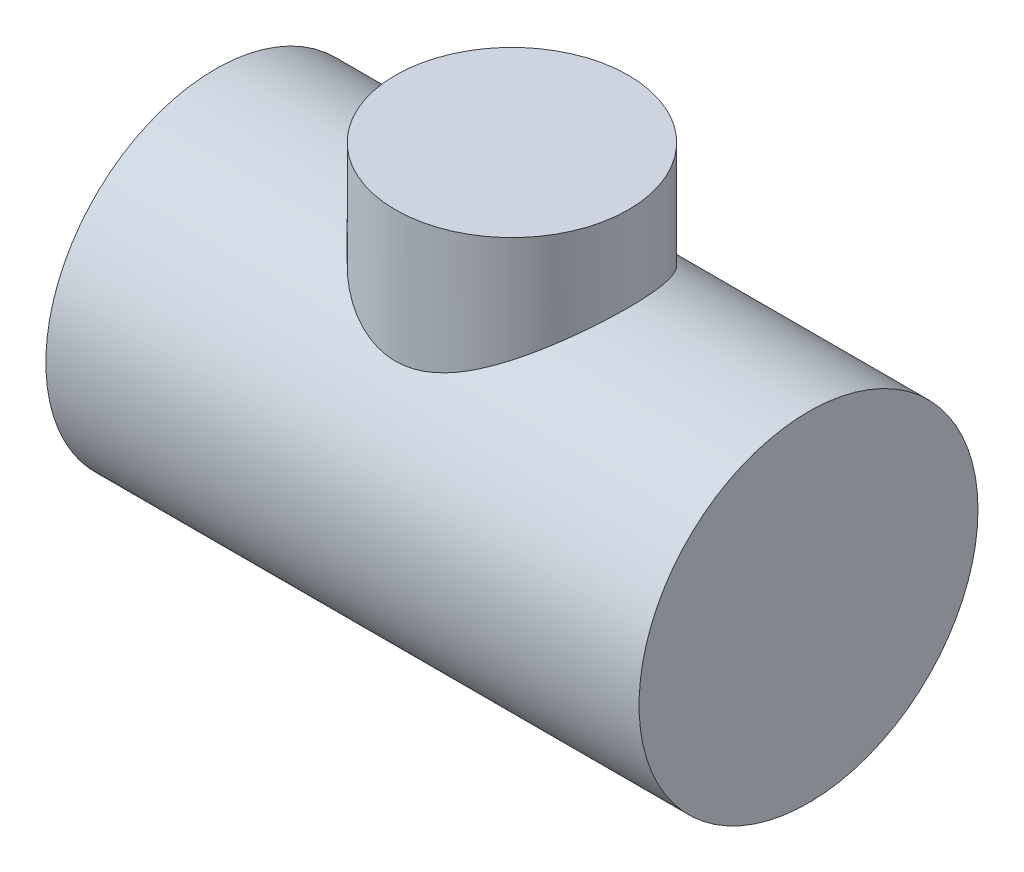
ISO-10303-21;
HEADER;
FILE_DESCRIPTION(('STEP AP214'),'2;1');
FILE_NAME('part.step','',(''),(''),'','','');
FILE_SCHEMA(('AUTOMOTIVE_DESIGN { 1 0 10303 214 1 1 1 1 }'));
ENDSEC;
DATA;
#1=APPLICATION_CONTEXT('core data for automotive mechanical design processes');
#2=APPLICATION_PROTOCOL_DEFINITION('international standard','automotive_design',2000,#1);
#3=PRODUCT_CONTEXT('',#1,'mechanical');
#4=PRODUCT('Part','Part','',(#3));
#5=PRODUCT_RELATED_PRODUCT_CATEGORY('part','',(#4));
#6=PRODUCT_DEFINITION_FORMATION('','',#4);
#7=PRODUCT_DEFINITION_CONTEXT('part definition',#1,'design');
#8=PRODUCT_DEFINITION('design','',#6,#7);
#9=PRODUCT_DEFINITION_SHAPE('','',#8);
#10=(LENGTH_UNIT() NAMED_UNIT(*) SI_UNIT(.MILLI.,.METRE.));
#11=(NAMED_UNIT(*) PLANE_ANGLE_UNIT() SI_UNIT($,.RADIAN.));
#12=(NAMED_UNIT(*) SI_UNIT($,.STERADIAN.) SOLID_ANGLE_UNIT());
#13=UNCERTAINTY_MEASURE_WITH_UNIT(LENGTH_MEASURE(1.E-05),#10,'distance_accuracy_value','');
#14=(GEOMETRIC_REPRESENTATION_CONTEXT(3) GLOBAL_UNCERTAINTY_ASSIGNED_CONTEXT((#13)) GLOBAL_UNIT_ASSIGNED_CONTEXT((#10,
#11,#12)) REPRESENTATION_CONTEXT('',''));
#15=CARTESIAN_POINT('',(0.,0.,0.));
#16=DIRECTION('',(0.,0.,1.));
#17=DIRECTION('',(1.,0.,0.));
#18=AXIS2_PLACEMENT_3D('',#15,#16,#17);
#19=CARTESIAN_POINT('',(88.9,0.,0.));
#20=DIRECTION('',(-1.,0.,0.));
#21=DIRECTION('',(0.,0.,1.));
#22=AXIS2_PLACEMENT_3D('',#19,#20,#21);
#23=CYLINDRICAL_SURFACE('',#22,50.8);
#24=CARTESIAN_POINT('',(88.9,0.,0.));
#25=DIRECTION('',(1.,0.,0.));
#26=DIRECTION('',(0.,0.,-1.));
#27=AXIS2_PLACEMENT_3D('',#24,#25,#26);
#28=CIRCLE('',#27,50.8);
#29=CARTESIAN_POINT('',(88.9,0.,-50.8));
#30=VERTEX_POINT('',#29);
#31=EDGE_CURVE('E42',#30,#30,#28,.T.);
#32=ORIENTED_EDGE('',*,*,#31,.F.);
#33=EDGE_LOOP('',(#32));
#34=FACE_BOUND('',#33,.T.);
#35=CARTESIAN_POINT('',(-88.9,0.,0.));
#36=DIRECTION('',(1.,0.,0.));
#37=DIRECTION('',(0.,0.,-1.));
#38=AXIS2_PLACEMENT_3D('',#35,#36,#37);
#39=CIRCLE('',#38,50.8);
#40=CARTESIAN_POINT('',(-88.9,0.,-50.8));
#41=VERTEX_POINT('',#40);
#42=EDGE_CURVE('E46',#41,#41,#39,.T.);
#43=ORIENTED_EDGE('',*,*,#42,.T.);
#44=EDGE_LOOP('',(#43));
#45=FACE_BOUND('',#44,.T.);
#46=CARTESIAN_POINT('',(0.,36.8901663726257,-34.925));
#47=CARTESIAN_POINT('',(-0.843645731352331,36.8901814735616,-34.9249914845288));
#48=CARTESIAN_POINT('',(-1.68741694630255,36.9192472565266,-34.8943613775967));
#49=CARTESIAN_POINT('',(-3.36673884233864,37.0339946630768,-34.7725461859095));
#50=CARTESIAN_POINT('',(-4.20228770120932,37.1196885618797,-34.6813479718474));
#51=CARTESIAN_POINT('',(-5.85919430438415,37.3435299889975,-34.4402049805243));
#52=CARTESIAN_POINT('',(-6.68052354412421,37.4817724238395,-34.2901538949403));
#53=CARTESIAN_POINT('',(-8.30159253245522,37.8043571230568,-33.9341723961664));
#54=CARTESIAN_POINT('',(-9.10133197777859,37.9887000346236,-33.7282411984882));
#55=CARTESIAN_POINT('',(-10.6665122789953,38.3939230305388,-33.2661981806663));
#56=CARTESIAN_POINT('',(-11.4322308708088,38.6143855983015,-33.0106542365401));
#57=CARTESIAN_POINT('',(-12.9360303517467,39.0859982808274,-32.450863810428));
#58=CARTESIAN_POINT('',(-13.6741063748994,39.3371537656572,-32.146608803005));
#59=CARTESIAN_POINT('',(-14.7589371672977,39.7315632108823,-31.6557575718443));
#60=CARTESIAN_POINT('',(-15.1168546460021,39.8659877746421,-31.4863843597101));
#61=CARTESIAN_POINT('',(-15.8250809971001,40.1398925175332,-31.136447887631));
#62=CARTESIAN_POINT('',(-16.1753918422367,40.2793713602015,-30.9558875769675));
#63=CARTESIAN_POINT('',(-17.2149476316831,40.704281717814,-30.3976983799822));
#64=CARTESIAN_POINT('',(-17.8927784395359,40.996173312477,-30.0035781882484));
#65=CARTESIAN_POINT('',(-19.3278911000392,41.6410208359239,-29.1036248806838));
#66=CARTESIAN_POINT('',(-20.0794524277431,41.9960128744349,-28.5901389257298));
#67=CARTESIAN_POINT('',(-21.538277518041,42.7127407810997,-27.5078739995737));
#68=CARTESIAN_POINT('',(-22.2455380457663,43.0744771392306,-26.9390909982723));
#69=CARTESIAN_POINT('',(-23.6147663047742,43.7972962674638,-25.7472923062065));
#70=CARTESIAN_POINT('',(-24.2766831134173,44.1583778733361,-25.1242173709284));
#71=CARTESIAN_POINT('',(-25.552132152644,44.8722254652959,-23.8258762877271));
#72=CARTESIAN_POINT('',(-26.1656612087246,45.2249909047345,-23.1506067212935));
#73=CARTESIAN_POINT('',(-27.4346400750145,45.9699874430229,-21.6383552410146));
#74=CARTESIAN_POINT('',(-28.0813399632175,46.3596205356045,-20.7926997439503));
#75=CARTESIAN_POINT('',(-29.3004436439954,47.1080561767333,-19.0363525940616));
#76=CARTESIAN_POINT('',(-29.8728344180272,47.4668533192823,-18.1256495884829));
#77=CARTESIAN_POINT('',(-30.9358777298752,48.1429629802574,-16.2447305784572));
#78=CARTESIAN_POINT('',(-31.4266562882585,48.4603392919954,-15.2746095540608));
#79=CARTESIAN_POINT('',(-32.0965538296489,48.8983108393477,-13.7791688332616));
#80=CARTESIAN_POINT('',(-32.3088052245657,49.0379506929057,-13.2739867535213));
#81=CARTESIAN_POINT('',(-32.7103782421536,49.3034531952045,-12.2510652803927));
#82=CARTESIAN_POINT('',(-32.8997018532293,49.429317038574,-11.7333269806195));
#83=CARTESIAN_POINT('',(-33.339133485046,49.7226711834187,-10.4366640021437));
#84=CARTESIAN_POINT('',(-33.5751808982284,49.8813939292305,-9.65091148354595));
#85=CARTESIAN_POINT('',(-33.9924578543145,50.1632126549853,-8.05887940763294));
#86=CARTESIAN_POINT('',(-34.1736968742308,50.2863147939891,-7.25260342523474));
#87=CARTESIAN_POINT('',(-34.478993921398,50.4942857879963,-5.62491757202212));
#88=CARTESIAN_POINT('',(-34.6030879404932,50.5791787076877,-4.80351756684122));
#89=CARTESIAN_POINT('',(-34.792528232709,50.7089698787006,-3.15078667308706));
#90=CARTESIAN_POINT('',(-34.8578725405307,50.753866792073,-2.31945545323676));
#91=CARTESIAN_POINT('',(-34.9289150265416,50.8026850345213,-0.651534823186891));
#92=CARTESIAN_POINT('',(-34.9345056596418,50.8065324824554,0.185061357119863));
#93=CARTESIAN_POINT('',(-34.8856773930319,50.772970673983,1.85565873418635));
#94=CARTESIAN_POINT('',(-34.8312587168032,50.7355615712207,2.68965994059845));
#95=CARTESIAN_POINT('',(-34.6631968012901,50.6203304525249,4.3490297418953));
#96=CARTESIAN_POINT('',(-34.54953938223,50.54249876079,5.17439622164246));
#97=CARTESIAN_POINT('',(-34.2646000329617,50.3481513682188,6.81045740898032));
#98=CARTESIAN_POINT('',(-34.093317965956,50.2316355755487,7.62115208173618));
#99=CARTESIAN_POINT('',(-33.6994250395464,49.9651382962085,9.20640778163735));
#100=CARTESIAN_POINT('',(-33.4779240776441,49.815882434471,9.98136809394376));
#101=CARTESIAN_POINT('',(-32.9843302016604,49.4855210998539,11.5079607953348));
#102=CARTESIAN_POINT('',(-32.7122383162544,49.3044162745698,12.2595936583785));
#103=CARTESIAN_POINT('',(-32.1202088055794,48.9136253459974,13.7361040676781));
#104=CARTESIAN_POINT('',(-31.8002681343419,48.7039374232352,14.460979906964));
#105=CARTESIAN_POINT('',(-31.1153666790649,48.2595330384554,15.8811590426831));
#106=CARTESIAN_POINT('',(-30.7504032180343,48.0248150883004,16.5764605773614));
#107=CARTESIAN_POINT('',(-29.9347005987139,47.5064268388663,18.0118093019905));
#108=CARTESIAN_POINT('',(-29.4789304726149,47.2202203382958,18.7480821394774));
#109=CARTESIAN_POINT('',(-28.5185152228662,46.62668268571,20.1790137298798));
#110=CARTESIAN_POINT('',(-28.0138669917221,46.3193501909407,20.8736698324024));
#111=CARTESIAN_POINT('',(-26.9582330453261,45.6886346929723,22.2203055964245));
#112=CARTESIAN_POINT('',(-26.4072020408622,45.3652361317398,22.8722424151399));
#113=CARTESIAN_POINT('',(-25.2618125951782,44.7082037573932,24.1313258169888));
#114=CARTESIAN_POINT('',(-24.6674519941495,44.3745694345478,24.7384701643561));
#115=CARTESIAN_POINT('',(-23.330930599084,43.6445999737335,26.0079518628684));
#116=CARTESIAN_POINT('',(-22.5809975725919,43.2474107559229,26.6616434240038));
#117=CARTESIAN_POINT('',(-21.0268742878215,42.4566380876803,27.9036936679047));
#118=CARTESIAN_POINT('',(-20.2226731802884,42.0630553762295,28.4920392241437));
#119=CARTESIAN_POINT('',(-18.5621111199666,41.2903908223469,29.6006712221761));
#120=CARTESIAN_POINT('',(-17.7057635739995,40.911305293161,30.1209750500881));
#121=CARTESIAN_POINT('',(-16.3838523810981,40.362786951746,30.8476534176125));
#122=CARTESIAN_POINT('',(-15.9370270623648,40.1833149553112,31.0808974087602));
#123=CARTESIAN_POINT('',(-15.0309386482855,39.8326359558851,31.5290666525978));
#124=CARTESIAN_POINT('',(-14.5716725253891,39.6614309934545,31.7439873924614));
#125=CARTESIAN_POINT('',(-13.3949511472192,39.2411463672361,32.263534048983));
#126=CARTESIAN_POINT('',(-12.6694183604267,38.9987734581222,32.5554806311321));
#127=CARTESIAN_POINT('',(-11.1921615977915,38.5441984865414,33.0924249101996));
#128=CARTESIAN_POINT('',(-10.4404443533484,38.3319887400827,33.3374345697353));
#129=CARTESIAN_POINT('',(-8.91433453387251,37.9447768155385,33.777504424466));
#130=CARTESIAN_POINT('',(-8.13997781391408,37.7697190825344,33.9726392900436));
#131=CARTESIAN_POINT('',(-6.5713820304971,37.4629972616678,34.3105825988925));
#132=CARTESIAN_POINT('',(-5.77714318075612,37.3313327075775,34.4533916043687));
#133=CARTESIAN_POINT('',(-4.16671271140394,37.1160831220056,34.6851814349556));
#134=CARTESIAN_POINT('',(-3.3503864055704,37.0329511888437,34.7736553753182));
#135=CARTESIAN_POINT('',(-1.70979182265391,36.9207025659829,34.8928150125601));
#136=CARTESIAN_POINT('',(-0.885523751504778,36.8915844794476,34.9235022038461));
#137=CARTESIAN_POINT('',(0.76312239502122,36.8888497975017,34.9263905513057));
#138=CARTESIAN_POINT('',(1.58750045271926,36.9152279736547,34.8985972170703));
#139=CARTESIAN_POINT('',(3.22867568298986,37.0221310038778,34.785166655381));
#140=CARTESIAN_POINT('',(4.04547307376917,37.1026542944693,34.6995310981622));
#141=CARTESIAN_POINT('',(5.56436912506833,37.3008196200195,34.4863310688893));
#142=CARTESIAN_POINT('',(6.26816729923438,37.4126442362929,34.3652565875931));
#143=CARTESIAN_POINT('',(7.66099956140281,37.6710370110227,34.0818091680351));
#144=CARTESIAN_POINT('',(8.35003225897651,37.8176084259596,33.9194323588026));
#145=CARTESIAN_POINT('',(9.37037041919324,38.060199114615,33.646337408857));
#146=CARTESIAN_POINT('',(9.70844039555545,38.1448977194905,33.5503309610904));
#147=CARTESIAN_POINT('',(10.3797825235907,38.3212660395582,33.3487407811598));
#148=CARTESIAN_POINT('',(10.7130558620354,38.4129339938817,33.2431594668808));
#149=CARTESIAN_POINT('',(11.7055727161755,38.6975836956687,32.9123335277399));
#150=CARTESIAN_POINT('',(12.357417809237,38.9001883389437,32.673032500777));
#151=CARTESIAN_POINT('',(13.9354657551569,39.4246177993149,32.0402449388077));
#152=CARTESIAN_POINT('',(14.8496330226445,39.7583487387811,31.6265320709174));
#153=CARTESIAN_POINT('',(16.629878664274,40.4569687242517,30.7278009331759));
#154=CARTESIAN_POINT('',(17.4959383602246,40.8218697346869,30.2427552306553));
#155=CARTESIAN_POINT('',(19.1792625476425,41.5711388299953,29.2042980244331));
#156=CARTESIAN_POINT('',(19.9964459057268,41.9555374273505,28.650777284119));
#157=CARTESIAN_POINT('',(21.5786287071585,42.73226765185,27.4788554507536));
#158=CARTESIAN_POINT('',(22.3436339790293,43.1245983865713,26.8604616239645));
#159=CARTESIAN_POINT('',(23.831145088715,43.9135979719272,25.5505345630253));
#160=CARTESIAN_POINT('',(24.5527800142559,44.3102363976799,24.8579933327232));
#161=CARTESIAN_POINT('',(25.9370144156452,45.0919830468468,23.4100412079154));
#162=CARTESIAN_POINT('',(26.5996095250225,45.4770904160502,22.654625671325));
#163=CARTESIAN_POINT('',(27.8608289837352,46.2261094291766,21.0841802042991));
#164=CARTESIAN_POINT('',(28.459538373767,46.5900489490847,20.2692320187475));
#165=CARTESIAN_POINT('',(29.5889829125796,47.2884274100382,18.5816582756494));
#166=CARTESIAN_POINT('',(30.1197319811195,47.6228723878282,17.7090445849494));
#167=CARTESIAN_POINT('',(31.023235185692,48.1998579918406,16.0635877832546));
#168=CARTESIAN_POINT('',(31.4074949861997,48.4483425793791,15.2991305995323));
#169=CARTESIAN_POINT('',(32.1218058256997,48.9144303970319,13.7362002647497));
#170=CARTESIAN_POINT('',(32.4518624399427,49.1320368029118,12.9377306228082));
#171=CARTESIAN_POINT('',(33.0540301773393,49.5318343340401,11.3109916673234));
#172=CARTESIAN_POINT('',(33.3261671652337,49.7140412641899,10.4827358491532));
#173=CARTESIAN_POINT('',(33.8092330624393,50.0391514853682,8.80094990511527));
#174=CARTESIAN_POINT('',(34.0201613014774,50.1820543459923,7.94741950258815));
#175=CARTESIAN_POINT('',(34.3787293615336,50.4258267727246,6.21641743072878));
#176=CARTESIAN_POINT('',(34.5260294896056,50.5264706519088,5.33884322639946));
#177=CARTESIAN_POINT('',(34.7533873338667,50.6821015907667,3.57097745640846));
#178=CARTESIAN_POINT('',(34.8334448659637,50.737088525444,2.68068585593676));
#179=CARTESIAN_POINT('',(34.9249679950039,50.7999670995288,0.895112689670286));
#180=CARTESIAN_POINT('',(34.9364487224561,50.8078691275587,-0.000167731775241016));
#181=CARTESIAN_POINT('',(34.8906564842974,50.7763920626338,-1.78809356295396));
#182=CARTESIAN_POINT('',(34.8333878196139,50.7370159273769,-2.68073913402008));
#183=CARTESIAN_POINT('',(34.6590596059218,50.6174990147927,-4.37817541014973));
#184=CARTESIAN_POINT('',(34.5476589748181,50.5412189393279,-5.18383008991765));
#185=CARTESIAN_POINT('',(34.2699403498627,50.3517911099989,-6.78114058265843));
#186=CARTESIAN_POINT('',(34.1036261604972,50.238645910208,-7.57279736142296));
#187=CARTESIAN_POINT('',(33.7181471197946,49.977772060461,-9.13736628901291));
#188=CARTESIAN_POINT('',(33.4989759825639,49.8300392973178,-9.91027619636801));
#189=CARTESIAN_POINT('',(33.0102928673679,49.5028371482697,-11.4330988192576));
#190=CARTESIAN_POINT('',(32.7407783161473,49.3233661401197,-12.1830103569704));
#191=CARTESIAN_POINT('',(32.1410847346888,48.9273008064707,-13.6891290073958));
#192=CARTESIAN_POINT('',(31.808739641091,48.7094097753484,-14.4441309308432));
#193=CARTESIAN_POINT('',(31.095296587989,48.2465352404641,-15.9220464066916));
#194=CARTESIAN_POINT('',(30.7141977786028,48.001551264424,-16.6449593994175));
#195=CARTESIAN_POINT('',(29.9063194435208,47.4886817873227,-18.0562710071865));
#196=CARTESIAN_POINT('',(29.4795378066389,47.2207952279568,-18.7446680249477));
#197=CARTESIAN_POINT('',(28.5830583647128,46.6663848028952,-20.0851842262553));
#198=CARTESIAN_POINT('',(28.1133554594105,46.379858723467,-20.7372990836058));
#199=CARTESIAN_POINT('',(27.3400183013485,45.9163318861592,-21.736921718799));
#200=CARTESIAN_POINT('',(27.0497490069515,45.7440219309702,-22.0970564177711));
#201=CARTESIAN_POINT('',(26.456189055011,45.3955573300754,-22.8043588396723));
#202=CARTESIAN_POINT('',(26.1529009859902,45.2194034520498,-23.1515291148827));
#203=CARTESIAN_POINT('',(25.2239185514405,44.6863829734259,-24.1734843966271));
#204=CARTESIAN_POINT('',(24.5791116308113,44.3249609535299,-24.828706538984));
#205=CARTESIAN_POINT('',(23.240036802404,43.5966430764542,-26.0864341140948));
#206=CARTESIAN_POINT('',(22.5456667072651,43.2297372198826,-26.6888245716733));
#207=CARTESIAN_POINT('',(21.1106194145993,42.4989558644997,-27.8377852812144));
#208=CARTESIAN_POINT('',(20.3699399802133,42.1350805130331,-28.3843528334251));
#209=CARTESIAN_POINT('',(18.7351388144899,41.3678261677201,-29.4933849753858));
#210=CARTESIAN_POINT('',(17.834182194157,40.9661959404635,-30.0470399285644));
#211=CARTESIAN_POINT('',(15.9757813576546,40.191989938932,-31.0750417184371));
#212=CARTESIAN_POINT('',(15.0183207873959,39.8194226495843,-31.5493654402674));
#213=CARTESIAN_POINT('',(13.0527126234124,39.1205570746653,-32.4118697186318));
#214=CARTESIAN_POINT('',(12.044741452909,38.7941111357414,-32.8003275308988));
#215=CARTESIAN_POINT('',(10.4972963798789,38.3514443702232,-33.3145297856323));
#216=CARTESIAN_POINT('',(9.975662372705,38.2117431005439,-33.4744941401013));
#217=CARTESIAN_POINT('',(8.92136241029694,37.9501571227367,-33.7707655767776));
#218=CARTESIAN_POINT('',(8.38869835764826,37.8282693706838,-33.9070767015312));
#219=CARTESIAN_POINT('',(7.21612216628492,37.5841892665651,-34.1775914018353));
#220=CARTESIAN_POINT('',(6.57425481924934,37.465938063215,-34.3069441626459));
#221=CARTESIAN_POINT('',(5.27954583687416,37.2605638618091,-34.5298912529963));
#222=CARTESIAN_POINT('',(4.6267068280542,37.1734335217734,-34.6234940169745));
#223=CARTESIAN_POINT('',(3.31364411899096,37.0329453994261,-34.7737201005729));
#224=CARTESIAN_POINT('',(2.65342646990105,36.9795617526384,-34.8303717417012));
#225=CARTESIAN_POINT('',(1.32883231192934,36.9081631070351,-34.906018436322));
#226=CARTESIAN_POINT('',(0.66445507553045,36.8901544791339,-34.925006706782));
#227=CARTESIAN_POINT('',(0.,36.8901663726257,-34.925));
#228=B_SPLINE_CURVE_WITH_KNOTS('',3,(#46,#47,#48,#49,#50,#51,#52,#53,#54,#55,#56,#57,#58,#59,
#60,#61,#62,#63,#64,#65,#66,#67,#68,#69,#70,#71,#72,#73,#74,#75,#76,#77,#78,#79,#80,#81,#82,#83,
#84,#85,#86,#87,#88,#89,#90,#91,#92,#93,#94,#95,#96,#97,#98,#99,#100,#101,#102,#103,#104,#105,
#106,#107,#108,#109,#110,#111,#112,#113,#114,#115,#116,#117,#118,#119,#120,#121,#122,#123,#124,
#125,#126,#127,#128,#129,#130,#131,#132,#133,#134,#135,#136,#137,#138,#139,#140,#141,#142,#143,
#144,#145,#146,#147,#148,#149,#150,#151,#152,#153,#154,#155,#156,#157,#158,#159,#160,#161,#162,
#163,#164,#165,#166,#167,#168,#169,#170,#171,#172,#173,#174,#175,#176,#177,#178,#179,#180,#181,
#182,#183,#184,#185,#186,#187,#188,#189,#190,#191,#192,#193,#194,#195,#196,#197,#198,#199,#200,
#201,#202,#203,#204,#205,#206,#207,#208,#209,#210,#211,#212,#213,#214,#215,#216,#217,#218,#219,
#220,#221,#222,#223,#224,#225,#226,#227),.UNSPECIFIED.,.T.,.F.,(4,2,2,2,2,2,2,2,2,2,2,2,2,2,2,2,
2,2,2,2,2,2,2,2,2,2,2,2,2,2,2,2,2,2,2,2,2,2,2,2,2,2,2,2,2,2,2,2,2,2,2,2,2,2,2,2,2,2,2,2,2,2,2,2,
2,2,2,2,2,2,2,2,2,2,2,2,2,2,2,2,2,2,2,2,2,2,2,2,2,2,4),(0.,2.5301216281033,5.06079188802998,
7.59605460999117,10.131352925778,12.6391815987962,15.1474496741658,16.4017362748348,
17.6556936004719,20.1637378702094,23.0920695067244,26.0206147229432,28.9523966389216,
31.8843707362163,35.2806999364483,38.6776233539674,42.0692517393557,43.7650141244392,
45.4606293396163,47.9647438711847,50.4684251641439,52.9705273903303,55.4727133138769,
57.9794019327186,60.4860812163981,62.9933607910948,65.5006463179693,67.9571484215589,
70.413600582064,72.8702091825525,75.3269639199695,78.0602866668365,80.7937833027688,
83.5299806567135,86.2663144926202,89.4764394320524,92.687208050762,95.8971546395916,
97.5018288134709,99.1068970670391,101.560926782791,104.01433021572,106.4640387144,
108.9137208919,111.385921839886,113.85805885411,116.329962972789,118.801795716539,
120.968136340988,123.134680075853,124.218993212984,125.303033293302,127.471416583983,
130.639316631596,133.808438168816,136.982682152345,140.156570976069,143.381008685433,
146.605684670401,149.826013163836,153.045681004927,155.715912126859,158.38586842095,
161.05462989897,163.723420600457,166.40628824944,169.089163243368,171.771446276735,
174.453561516572,176.90142385067,179.349116629103,181.79710063756,184.245209806632,
186.802273199171,189.359381172888,191.916607371847,194.474137837583,195.954622007913,
197.434813164881,200.39522502466,203.361927409202,206.328773203899,209.717889947516,
213.107992469466,216.486983248695,218.175879190802,219.864486200737,221.858851160335,
223.852745301576,225.845109403942,227.837832291081),.UNSPECIFIED.);
#229=CARTESIAN_POINT('',(0.,36.8901663726257,-34.925));
#230=VERTEX_POINT('',#229);
#231=EDGE_CURVE('E10',#230,#230,#228,.T.);
#232=ORIENTED_EDGE('',*,*,#231,.F.);
#233=EDGE_LOOP('',(#232));
#234=FACE_BOUND('',#233,.T.);
#235=ADVANCED_FACE('F31',(#34,#45,#234),#23,.T.);
#236=CARTESIAN_POINT('',(88.9,0.,0.));
#237=DIRECTION('',(1.,0.,0.));
#238=DIRECTION('',(0.,0.,-1.));
#239=AXIS2_PLACEMENT_3D('',#236,#237,#238);
#240=PLANE('',#239);
#241=ORIENTED_EDGE('',*,*,#31,.T.);
#242=EDGE_LOOP('',(#241));
#243=FACE_BOUND('',#242,.T.);
#244=ADVANCED_FACE('F66',(#243),#240,.T.);
#245=CARTESIAN_POINT('',(-88.9,0.,0.));
#246=DIRECTION('',(1.,0.,0.));
#247=DIRECTION('',(0.,0.,-1.));
#248=AXIS2_PLACEMENT_3D('',#245,#246,#247);
#249=PLANE('',#248);
#250=ORIENTED_EDGE('',*,*,#42,.F.);
#251=EDGE_LOOP('',(#250));
#252=FACE_BOUND('',#251,.T.);
#253=ADVANCED_FACE('F60',(#252),#249,.F.);
#254=CARTESIAN_POINT('',(0.,76.2,0.));
#255=DIRECTION('',(0.,-1.,0.));
#256=DIRECTION('',(0.,0.,-1.));
#257=AXIS2_PLACEMENT_3D('',#254,#255,#256);
#258=CYLINDRICAL_SURFACE('',#257,34.925);
#259=CARTESIAN_POINT('',(0.,76.2,0.));
#260=DIRECTION('',(0.,1.,0.));
#261=DIRECTION('',(0.,0.,1.));
#262=AXIS2_PLACEMENT_3D('',#259,#260,#261);
#263=CIRCLE('',#262,34.925);
#264=CARTESIAN_POINT('',(0.,76.2,34.925));
#265=VERTEX_POINT('',#264);
#266=EDGE_CURVE('E51',#265,#265,#263,.T.);
#267=ORIENTED_EDGE('',*,*,#266,.F.);
#268=EDGE_LOOP('',(#267));
#269=FACE_BOUND('',#268,.T.);
#270=ORIENTED_EDGE('',*,*,#231,.T.);
#271=EDGE_LOOP('',(#270));
#272=FACE_BOUND('',#271,.T.);
#273=ADVANCED_FACE('F58',(#269,#272),#258,.T.);
#274=CARTESIAN_POINT('',(0.,76.2,0.));
#275=DIRECTION('',(0.,1.,0.));
#276=DIRECTION('',(0.,0.,1.));
#277=AXIS2_PLACEMENT_3D('',#274,#275,#276);
#278=PLANE('',#277);
#279=ORIENTED_EDGE('',*,*,#266,.T.);
#280=EDGE_LOOP('',(#279));
#281=FACE_BOUND('',#280,.T.);
#282=ADVANCED_FACE('F56',(#281),#278,.T.);
#283=CLOSED_SHELL('',(#235,#244,#253,#273,#282));
#284=MANIFOLD_SOLID_BREP('B2',#283);
#285=ADVANCED_BREP_SHAPE_REPRESENTATION('',(#18,#284),#14);
#286=SHAPE_DEFINITION_REPRESENTATION(#9,#285);
ENDSEC;
END-ISO-10303-21;
